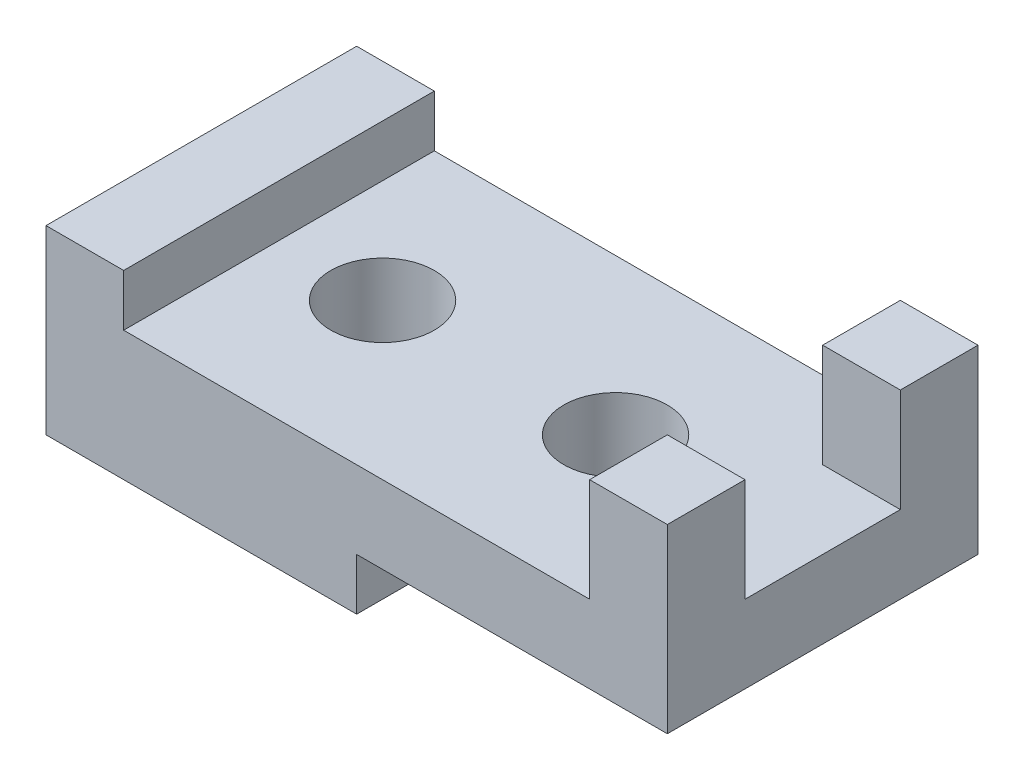
ISO-10303-21;
HEADER;
FILE_DESCRIPTION(('STEP AP214'),'2;1');
FILE_NAME('part.step','',(''),(''),'','','');
FILE_SCHEMA(('AUTOMOTIVE_DESIGN { 1 0 10303 214 1 1 1 1 }'));
ENDSEC;
DATA;
#1=APPLICATION_CONTEXT('core data for automotive mechanical design processes');
#2=APPLICATION_PROTOCOL_DEFINITION('international standard','automotive_design',2000,#1);
#3=PRODUCT_CONTEXT('',#1,'mechanical');
#4=PRODUCT('Part','Part','',(#3));
#5=PRODUCT_RELATED_PRODUCT_CATEGORY('part','',(#4));
#6=PRODUCT_DEFINITION_FORMATION('','',#4);
#7=PRODUCT_DEFINITION_CONTEXT('part definition',#1,'design');
#8=PRODUCT_DEFINITION('design','',#6,#7);
#9=PRODUCT_DEFINITION_SHAPE('','',#8);
#10=(LENGTH_UNIT() NAMED_UNIT(*) SI_UNIT(.MILLI.,.METRE.));
#11=(NAMED_UNIT(*) PLANE_ANGLE_UNIT() SI_UNIT($,.RADIAN.));
#12=(NAMED_UNIT(*) SI_UNIT($,.STERADIAN.) SOLID_ANGLE_UNIT());
#13=UNCERTAINTY_MEASURE_WITH_UNIT(LENGTH_MEASURE(1.E-05),#10,'distance_accuracy_value','');
#14=(GEOMETRIC_REPRESENTATION_CONTEXT(3) GLOBAL_UNCERTAINTY_ASSIGNED_CONTEXT((#13)) GLOBAL_UNIT_ASSIGNED_CONTEXT((#10,
#11,#12)) REPRESENTATION_CONTEXT('',''));
#15=CARTESIAN_POINT('',(0.,0.,0.));
#16=DIRECTION('',(0.,0.,1.));
#17=DIRECTION('',(1.,0.,0.));
#18=AXIS2_PLACEMENT_3D('',#15,#16,#17);
#19=CARTESIAN_POINT('',(45.,17.5,-60.));
#20=DIRECTION('',(-1.,0.,0.));
#21=DIRECTION('',(0.,0.,1.));
#22=AXIS2_PLACEMENT_3D('',#19,#20,#21);
#23=PLANE('',#22);
#24=DIRECTION('',(0.,1.,0.));
#25=VECTOR('',#24,1.);
#26=CARTESIAN_POINT('',(45.,-2.49999999999999,-45.));
#27=LINE('',#26,#25);
#28=CARTESIAN_POINT('',(45.,-2.49999999999999,-45.));
#29=VERTEX_POINT('',#28);
#30=CARTESIAN_POINT('',(45.,17.5,-45.));
#31=VERTEX_POINT('',#30);
#32=EDGE_CURVE('E320',#29,#31,#27,.T.);
#33=ORIENTED_EDGE('',*,*,#32,.T.);
#34=DIRECTION('',(0.,0.,1.));
#35=VECTOR('',#34,1.);
#36=CARTESIAN_POINT('',(45.,17.5,-60.));
#37=LINE('',#36,#35);
#38=CARTESIAN_POINT('',(45.,17.5,-60.));
#39=VERTEX_POINT('',#38);
#40=EDGE_CURVE('E162',#39,#31,#37,.T.);
#41=ORIENTED_EDGE('',*,*,#40,.F.);
#42=DIRECTION('',(0.,-1.,0.));
#43=VECTOR('',#42,1.);
#44=CARTESIAN_POINT('',(45.,17.5,-60.));
#45=LINE('',#44,#43);
#46=CARTESIAN_POINT('',(45.,-2.5,-60.));
#47=VERTEX_POINT('',#46);
#48=EDGE_CURVE('E156',#39,#47,#45,.T.);
#49=ORIENTED_EDGE('',*,*,#48,.T.);
#50=DIRECTION('',(0.,0.,1.));
#51=VECTOR('',#50,1.);
#52=CARTESIAN_POINT('',(45.,-2.5,-60.));
#53=LINE('',#52,#51);
#54=EDGE_CURVE('E135',#47,#29,#53,.T.);
#55=ORIENTED_EDGE('',*,*,#54,.T.);
#56=EDGE_LOOP('',(#33,#41,#49,#55));
#57=FACE_BOUND('',#56,.T.);
#58=ADVANCED_FACE('F38',(#57),#23,.T.);
#59=CARTESIAN_POINT('',(60.,17.5,-60.));
#60=DIRECTION('',(0.,1.,0.));
#61=DIRECTION('',(0.,0.,1.));
#62=AXIS2_PLACEMENT_3D('',#59,#60,#61);
#63=PLANE('',#62);
#64=DIRECTION('',(1.,0.,0.));
#65=VECTOR('',#64,1.);
#66=CARTESIAN_POINT('',(45.,17.5,-45.));
#67=LINE('',#66,#65);
#68=CARTESIAN_POINT('',(60.,17.5,-45.));
#69=VERTEX_POINT('',#68);
#70=EDGE_CURVE('E309',#31,#69,#67,.T.);
#71=ORIENTED_EDGE('',*,*,#70,.T.);
#72=DIRECTION('',(0.,0.,1.));
#73=VECTOR('',#72,1.);
#74=CARTESIAN_POINT('',(60.,17.5,-60.));
#75=LINE('',#74,#73);
#76=CARTESIAN_POINT('',(60.,17.5,-60.));
#77=VERTEX_POINT('',#76);
#78=EDGE_CURVE('E220',#77,#69,#75,.T.);
#79=ORIENTED_EDGE('',*,*,#78,.F.);
#80=DIRECTION('',(-1.,0.,0.));
#81=VECTOR('',#80,1.);
#82=CARTESIAN_POINT('',(60.,17.5,-60.));
#83=LINE('',#82,#81);
#84=EDGE_CURVE('E164',#77,#39,#83,.T.);
#85=ORIENTED_EDGE('',*,*,#84,.T.);
#86=ORIENTED_EDGE('',*,*,#40,.T.);
#87=EDGE_LOOP('',(#71,#79,#85,#86));
#88=FACE_BOUND('',#87,.T.);
#89=ADVANCED_FACE('F387',(#88),#63,.T.);
#90=CARTESIAN_POINT('',(-45.,7.5,-60.));
#91=DIRECTION('',(0.,1.,0.));
#92=DIRECTION('',(-1.,0.,0.));
#93=AXIS2_PLACEMENT_3D('',#90,#91,#92);
#94=PLANE('',#93);
#95=DIRECTION('',(-1.,0.,0.));
#96=VECTOR('',#95,1.);
#97=CARTESIAN_POINT('',(-45.,7.5,0.));
#98=LINE('',#97,#96);
#99=CARTESIAN_POINT('',(-45.,7.5,0.));
#100=VERTEX_POINT('',#99);
#101=CARTESIAN_POINT('',(-60.,7.49999999999999,0.));
#102=VERTEX_POINT('',#101);
#103=EDGE_CURVE('E174',#100,#102,#98,.T.);
#104=ORIENTED_EDGE('',*,*,#103,.F.);
#105=DIRECTION('',(0.,0.,1.));
#106=VECTOR('',#105,1.);
#107=CARTESIAN_POINT('',(-45.,7.5,-60.));
#108=LINE('',#107,#106);
#109=CARTESIAN_POINT('',(-45.,7.5,-60.));
#110=VERTEX_POINT('',#109);
#111=EDGE_CURVE('E11',#110,#100,#108,.T.);
#112=ORIENTED_EDGE('',*,*,#111,.F.);
#113=DIRECTION('',(-1.,0.,0.));
#114=VECTOR('',#113,1.);
#115=CARTESIAN_POINT('',(-45.,7.5,-60.));
#116=LINE('',#115,#114);
#117=CARTESIAN_POINT('',(-60.,7.49999999999999,-60.));
#118=VERTEX_POINT('',#117);
#119=EDGE_CURVE('E213',#110,#118,#116,.T.);
#120=ORIENTED_EDGE('',*,*,#119,.T.);
#121=DIRECTION('',(0.,0.,1.));
#122=VECTOR('',#121,1.);
#123=CARTESIAN_POINT('',(-60.,7.49999999999999,-60.));
#124=LINE('',#123,#122);
#125=EDGE_CURVE('E108',#118,#102,#124,.T.);
#126=ORIENTED_EDGE('',*,*,#125,.T.);
#127=EDGE_LOOP('',(#104,#112,#120,#126));
#128=FACE_BOUND('',#127,.T.);
#129=ADVANCED_FACE('F40',(#128),#94,.T.);
#130=CARTESIAN_POINT('',(-45.,-2.50000000000001,-60.));
#131=DIRECTION('',(1.,0.,0.));
#132=DIRECTION('',(0.,0.,-1.));
#133=AXIS2_PLACEMENT_3D('',#130,#131,#132);
#134=PLANE('',#133);
#135=DIRECTION('',(0.,1.,0.));
#136=VECTOR('',#135,1.);
#137=CARTESIAN_POINT('',(-45.,-2.50000000000001,0.));
#138=LINE('',#137,#136);
#139=CARTESIAN_POINT('',(-45.,-2.50000000000001,0.));
#140=VERTEX_POINT('',#139);
#141=EDGE_CURVE('E210',#140,#100,#138,.T.);
#142=ORIENTED_EDGE('',*,*,#141,.F.);
#143=DIRECTION('',(0.,0.,1.));
#144=VECTOR('',#143,1.);
#145=CARTESIAN_POINT('',(-45.,-2.50000000000001,-60.));
#146=LINE('',#145,#144);
#147=CARTESIAN_POINT('',(-45.,-2.50000000000001,-60.));
#148=VERTEX_POINT('',#147);
#149=EDGE_CURVE('E48',#148,#140,#146,.T.);
#150=ORIENTED_EDGE('',*,*,#149,.F.);
#151=DIRECTION('',(0.,1.,0.));
#152=VECTOR('',#151,1.);
#153=CARTESIAN_POINT('',(-45.,-2.50000000000001,-60.));
#154=LINE('',#153,#152);
#155=EDGE_CURVE('E158',#148,#110,#154,.T.);
#156=ORIENTED_EDGE('',*,*,#155,.T.);
#157=ORIENTED_EDGE('',*,*,#111,.T.);
#158=EDGE_LOOP('',(#142,#150,#156,#157));
#159=FACE_BOUND('',#158,.T.);
#160=ADVANCED_FACE('F242',(#159),#134,.T.);
#161=CARTESIAN_POINT('',(45.,-2.5,-60.));
#162=DIRECTION('',(0.,1.,0.));
#163=DIRECTION('',(-1.,0.,0.));
#164=AXIS2_PLACEMENT_3D('',#161,#162,#163);
#165=PLANE('',#164);
#166=CARTESIAN_POINT('',(-25.,-2.5,-30.));
#167=DIRECTION('',(0.,1.,0.));
#168=DIRECTION('',(-1.,0.,0.));
#169=AXIS2_PLACEMENT_3D('',#166,#167,#168);
#170=CIRCLE('',#169,10.);
#171=CARTESIAN_POINT('',(-35.,-2.5,-30.));
#172=VERTEX_POINT('',#171);
#173=EDGE_CURVE('E308',#172,#172,#170,.T.);
#174=ORIENTED_EDGE('',*,*,#173,.F.);
#175=EDGE_LOOP('',(#174));
#176=FACE_BOUND('',#175,.T.);
#177=CARTESIAN_POINT('',(20.,-2.5,-30.));
#178=DIRECTION('',(0.,1.,0.));
#179=DIRECTION('',(-1.,0.,0.));
#180=AXIS2_PLACEMENT_3D('',#177,#178,#179);
#181=CIRCLE('',#180,10.);
#182=CARTESIAN_POINT('',(9.99999999999999,-2.5,-30.));
#183=VERTEX_POINT('',#182);
#184=EDGE_CURVE('E304',#183,#183,#181,.T.);
#185=ORIENTED_EDGE('',*,*,#184,.F.);
#186=EDGE_LOOP('',(#185));
#187=FACE_BOUND('',#186,.T.);
#188=DIRECTION('',(-1.,0.,0.));
#189=VECTOR('',#188,1.);
#190=CARTESIAN_POINT('',(45.,-2.5,0.));
#191=LINE('',#190,#189);
#192=CARTESIAN_POINT('',(45.,-2.5,0.));
#193=VERTEX_POINT('',#192);
#194=EDGE_CURVE('E206',#193,#140,#191,.T.);
#195=ORIENTED_EDGE('',*,*,#194,.F.);
#196=CARTESIAN_POINT('',(45.,-2.49999999999999,-15.));
#197=VERTEX_POINT('',#196);
#198=EDGE_CURVE('E150',#197,#193,#53,.T.);
#199=ORIENTED_EDGE('',*,*,#198,.F.);
#200=DIRECTION('',(1.,0.,0.));
#201=VECTOR('',#200,1.);
#202=CARTESIAN_POINT('',(45.,-2.49999999999999,-15.));
#203=LINE('',#202,#201);
#204=CARTESIAN_POINT('',(60.,-2.49999999999999,-15.));
#205=VERTEX_POINT('',#204);
#206=EDGE_CURVE('E319',#197,#205,#203,.T.);
#207=ORIENTED_EDGE('',*,*,#206,.T.);
#208=DIRECTION('',(0.,0.,-1.));
#209=VECTOR('',#208,1.);
#210=CARTESIAN_POINT('',(60.,-2.49999999999999,-15.));
#211=LINE('',#210,#209);
#212=CARTESIAN_POINT('',(60.,-2.49999999999999,-45.));
#213=VERTEX_POINT('',#212);
#214=EDGE_CURVE('E332',#205,#213,#211,.T.);
#215=ORIENTED_EDGE('',*,*,#214,.T.);
#216=DIRECTION('',(1.,0.,0.));
#217=VECTOR('',#216,1.);
#218=CARTESIAN_POINT('',(45.,-2.49999999999999,-45.));
#219=LINE('',#218,#217);
#220=EDGE_CURVE('E144',#29,#213,#219,.T.);
#221=ORIENTED_EDGE('',*,*,#220,.F.);
#222=ORIENTED_EDGE('',*,*,#54,.F.);
#223=DIRECTION('',(-1.,0.,0.));
#224=VECTOR('',#223,1.);
#225=CARTESIAN_POINT('',(45.,-2.5,-60.));
#226=LINE('',#225,#224);
#227=EDGE_CURVE('E139',#47,#148,#226,.T.);
#228=ORIENTED_EDGE('',*,*,#227,.T.);
#229=ORIENTED_EDGE('',*,*,#149,.T.);
#230=EDGE_LOOP('',(#195,#199,#207,#215,#221,#222,#228,#229));
#231=FACE_BOUND('',#230,.T.);
#232=ADVANCED_FACE('F138',(#176,#187,#231),#165,.T.);
#233=DIRECTION('',(0.,-1.,0.));
#234=VECTOR('',#233,1.);
#235=CARTESIAN_POINT('',(45.,17.5,-15.));
#236=LINE('',#235,#234);
#237=CARTESIAN_POINT('',(45.,17.5,-15.));
#238=VERTEX_POINT('',#237);
#239=EDGE_CURVE('E253',#238,#197,#236,.T.);
#240=ORIENTED_EDGE('',*,*,#239,.T.);
#241=ORIENTED_EDGE('',*,*,#198,.T.);
#242=DIRECTION('',(0.,-1.,0.));
#243=VECTOR('',#242,1.);
#244=CARTESIAN_POINT('',(45.,17.5,0.));
#245=LINE('',#244,#243);
#246=CARTESIAN_POINT('',(45.,17.5,0.));
#247=VERTEX_POINT('',#246);
#248=EDGE_CURVE('E202',#247,#193,#245,.T.);
#249=ORIENTED_EDGE('',*,*,#248,.F.);
#250=EDGE_CURVE('E219',#238,#247,#37,.T.);
#251=ORIENTED_EDGE('',*,*,#250,.F.);
#252=EDGE_LOOP('',(#240,#241,#249,#251));
#253=FACE_BOUND('',#252,.T.);
#254=ADVANCED_FACE('F251',(#253),#23,.T.);
#255=DIRECTION('',(1.,0.,0.));
#256=VECTOR('',#255,1.);
#257=CARTESIAN_POINT('',(45.,17.5,-15.));
#258=LINE('',#257,#256);
#259=CARTESIAN_POINT('',(60.,17.5,-15.));
#260=VERTEX_POINT('',#259);
#261=EDGE_CURVE('E56',#238,#260,#258,.T.);
#262=ORIENTED_EDGE('',*,*,#261,.F.);
#263=ORIENTED_EDGE('',*,*,#250,.T.);
#264=DIRECTION('',(-1.,0.,0.));
#265=VECTOR('',#264,1.);
#266=CARTESIAN_POINT('',(60.,17.5,0.));
#267=LINE('',#266,#265);
#268=CARTESIAN_POINT('',(60.,17.5,0.));
#269=VERTEX_POINT('',#268);
#270=EDGE_CURVE('E198',#269,#247,#267,.T.);
#271=ORIENTED_EDGE('',*,*,#270,.F.);
#272=EDGE_CURVE('E224',#260,#269,#75,.T.);
#273=ORIENTED_EDGE('',*,*,#272,.F.);
#274=EDGE_LOOP('',(#262,#263,#271,#273));
#275=FACE_BOUND('',#274,.T.);
#276=ADVANCED_FACE('F275',(#275),#63,.T.);
#277=CARTESIAN_POINT('',(60.,-17.5,-60.));
#278=DIRECTION('',(1.,0.,0.));
#279=DIRECTION('',(0.,0.,-1.));
#280=AXIS2_PLACEMENT_3D('',#277,#278,#279);
#281=PLANE('',#280);
#282=DIRECTION('',(0.,1.,0.));
#283=VECTOR('',#282,1.);
#284=CARTESIAN_POINT('',(60.,-2.49999999999999,-45.));
#285=LINE('',#284,#283);
#286=EDGE_CURVE('E328',#213,#69,#285,.T.);
#287=ORIENTED_EDGE('',*,*,#286,.F.);
#288=ORIENTED_EDGE('',*,*,#214,.F.);
#289=DIRECTION('',(0.,-1.,0.));
#290=VECTOR('',#289,1.);
#291=CARTESIAN_POINT('',(60.,17.5,-15.));
#292=LINE('',#291,#290);
#293=EDGE_CURVE('E273',#260,#205,#292,.T.);
#294=ORIENTED_EDGE('',*,*,#293,.F.);
#295=ORIENTED_EDGE('',*,*,#272,.T.);
#296=DIRECTION('',(0.,1.,0.));
#297=VECTOR('',#296,1.);
#298=CARTESIAN_POINT('',(60.,-17.5,0.));
#299=LINE('',#298,#297);
#300=CARTESIAN_POINT('',(60.,-17.5,0.));
#301=VERTEX_POINT('',#300);
#302=EDGE_CURVE('E194',#301,#269,#299,.T.);
#303=ORIENTED_EDGE('',*,*,#302,.F.);
#304=DIRECTION('',(0.,0.,1.));
#305=VECTOR('',#304,1.);
#306=CARTESIAN_POINT('',(60.,-17.5,-60.));
#307=LINE('',#306,#305);
#308=CARTESIAN_POINT('',(60.,-17.5,-60.));
#309=VERTEX_POINT('',#308);
#310=EDGE_CURVE('E225',#309,#301,#307,.T.);
#311=ORIENTED_EDGE('',*,*,#310,.F.);
#312=DIRECTION('',(0.,1.,0.));
#313=VECTOR('',#312,1.);
#314=CARTESIAN_POINT('',(60.,-17.5,-60.));
#315=LINE('',#314,#313);
#316=EDGE_CURVE('E168',#309,#77,#315,.T.);
#317=ORIENTED_EDGE('',*,*,#316,.T.);
#318=ORIENTED_EDGE('',*,*,#78,.T.);
#319=EDGE_LOOP('',(#287,#288,#294,#295,#303,#311,#317,#318));
#320=FACE_BOUND('',#319,.T.);
#321=ADVANCED_FACE('F271',(#320),#281,.T.);
#322=CARTESIAN_POINT('',(0.,-17.5,-60.));
#323=DIRECTION('',(0.,-1.,0.));
#324=DIRECTION('',(1.,0.,0.));
#325=AXIS2_PLACEMENT_3D('',#322,#323,#324);
#326=PLANE('',#325);
#327=CARTESIAN_POINT('',(20.,-17.5,-30.));
#328=DIRECTION('',(0.,-1.,0.));
#329=DIRECTION('',(1.,0.,0.));
#330=AXIS2_PLACEMENT_3D('',#327,#328,#329);
#331=CIRCLE('',#330,10.);
#332=CARTESIAN_POINT('',(30.,-17.5,-30.));
#333=VERTEX_POINT('',#332);
#334=EDGE_CURVE('E42',#333,#333,#331,.T.);
#335=ORIENTED_EDGE('',*,*,#334,.F.);
#336=EDGE_LOOP('',(#335));
#337=FACE_BOUND('',#336,.T.);
#338=DIRECTION('',(1.,0.,0.));
#339=VECTOR('',#338,1.);
#340=CARTESIAN_POINT('',(0.,-17.5,0.));
#341=LINE('',#340,#339);
#342=CARTESIAN_POINT('',(0.,-17.5,0.));
#343=VERTEX_POINT('',#342);
#344=EDGE_CURVE('E190',#343,#301,#341,.T.);
#345=ORIENTED_EDGE('',*,*,#344,.F.);
#346=DIRECTION('',(0.,0.,1.));
#347=VECTOR('',#346,1.);
#348=CARTESIAN_POINT('',(0.,-17.5,-60.));
#349=LINE('',#348,#347);
#350=CARTESIAN_POINT('',(0.,-17.5,-60.));
#351=VERTEX_POINT('',#350);
#352=EDGE_CURVE('E228',#351,#343,#349,.T.);
#353=ORIENTED_EDGE('',*,*,#352,.F.);
#354=DIRECTION('',(1.,0.,0.));
#355=VECTOR('',#354,1.);
#356=CARTESIAN_POINT('',(0.,-17.5,-60.));
#357=LINE('',#356,#355);
#358=EDGE_CURVE('E282',#351,#309,#357,.T.);
#359=ORIENTED_EDGE('',*,*,#358,.T.);
#360=ORIENTED_EDGE('',*,*,#310,.T.);
#361=EDGE_LOOP('',(#345,#353,#359,#360));
#362=FACE_BOUND('',#361,.T.);
#363=ADVANCED_FACE('F279',(#337,#362),#326,.T.);
#364=CARTESIAN_POINT('',(0.,-27.5,-60.));
#365=DIRECTION('',(1.,0.,0.));
#366=DIRECTION('',(0.,1.,0.));
#367=AXIS2_PLACEMENT_3D('',#364,#365,#366);
#368=PLANE('',#367);
#369=DIRECTION('',(0.,1.,0.));
#370=VECTOR('',#369,1.);
#371=CARTESIAN_POINT('',(0.,-27.5,0.));
#372=LINE('',#371,#370);
#373=CARTESIAN_POINT('',(0.,-27.5,0.));
#374=VERTEX_POINT('',#373);
#375=EDGE_CURVE('E186',#374,#343,#372,.T.);
#376=ORIENTED_EDGE('',*,*,#375,.F.);
#377=DIRECTION('',(0.,0.,1.));
#378=VECTOR('',#377,1.);
#379=CARTESIAN_POINT('',(0.,-27.5,-60.));
#380=LINE('',#379,#378);
#381=CARTESIAN_POINT('',(0.,-27.5,-60.));
#382=VERTEX_POINT('',#381);
#383=EDGE_CURVE('E231',#382,#374,#380,.T.);
#384=ORIENTED_EDGE('',*,*,#383,.F.);
#385=DIRECTION('',(0.,1.,0.));
#386=VECTOR('',#385,1.);
#387=CARTESIAN_POINT('',(0.,-27.5,-60.));
#388=LINE('',#387,#386);
#389=EDGE_CURVE('E290',#382,#351,#388,.T.);
#390=ORIENTED_EDGE('',*,*,#389,.T.);
#391=ORIENTED_EDGE('',*,*,#352,.T.);
#392=EDGE_LOOP('',(#376,#384,#390,#391));
#393=FACE_BOUND('',#392,.T.);
#394=ADVANCED_FACE('F376',(#393),#368,.T.);
#395=CARTESIAN_POINT('',(-60.,-27.5,-60.));
#396=DIRECTION('',(0.,-1.,0.));
#397=DIRECTION('',(0.,0.,-1.));
#398=AXIS2_PLACEMENT_3D('',#395,#396,#397);
#399=PLANE('',#398);
#400=CARTESIAN_POINT('',(-25.,-27.5,-30.));
#401=DIRECTION('',(0.,1.,0.));
#402=DIRECTION('',(-1.,0.,0.));
#403=AXIS2_PLACEMENT_3D('',#400,#401,#402);
#404=CIRCLE('',#403,10.);
#405=CARTESIAN_POINT('',(-35.,-27.5,-30.));
#406=VERTEX_POINT('',#405);
#407=EDGE_CURVE('E313',#406,#406,#404,.T.);
#408=ORIENTED_EDGE('',*,*,#407,.T.);
#409=EDGE_LOOP('',(#408));
#410=FACE_BOUND('',#409,.T.);
#411=DIRECTION('',(1.,0.,0.));
#412=VECTOR('',#411,1.);
#413=CARTESIAN_POINT('',(-60.,-27.5,0.));
#414=LINE('',#413,#412);
#415=CARTESIAN_POINT('',(-60.,-27.5,0.));
#416=VERTEX_POINT('',#415);
#417=EDGE_CURVE('E182',#416,#374,#414,.T.);
#418=ORIENTED_EDGE('',*,*,#417,.F.);
#419=DIRECTION('',(0.,0.,1.));
#420=VECTOR('',#419,1.);
#421=CARTESIAN_POINT('',(-60.,-27.5,-60.));
#422=LINE('',#421,#420);
#423=CARTESIAN_POINT('',(-60.,-27.5,-60.));
#424=VERTEX_POINT('',#423);
#425=EDGE_CURVE('E234',#424,#416,#422,.T.);
#426=ORIENTED_EDGE('',*,*,#425,.F.);
#427=DIRECTION('',(1.,0.,0.));
#428=VECTOR('',#427,1.);
#429=CARTESIAN_POINT('',(-60.,-27.5,-60.));
#430=LINE('',#429,#428);
#431=EDGE_CURVE('E295',#424,#382,#430,.T.);
#432=ORIENTED_EDGE('',*,*,#431,.T.);
#433=ORIENTED_EDGE('',*,*,#383,.T.);
#434=EDGE_LOOP('',(#418,#426,#432,#433));
#435=FACE_BOUND('',#434,.T.);
#436=ADVANCED_FACE('F382',(#410,#435),#399,.T.);
#437=CARTESIAN_POINT('',(-60.,7.49999999999999,-60.));
#438=DIRECTION('',(-1.,0.,0.));
#439=DIRECTION('',(0.,-1.,0.));
#440=AXIS2_PLACEMENT_3D('',#437,#438,#439);
#441=PLANE('',#440);
#442=DIRECTION('',(0.,-1.,0.));
#443=VECTOR('',#442,1.);
#444=CARTESIAN_POINT('',(-60.,7.49999999999999,0.));
#445=LINE('',#444,#443);
#446=EDGE_CURVE('E178',#102,#416,#445,.T.);
#447=ORIENTED_EDGE('',*,*,#446,.F.);
#448=ORIENTED_EDGE('',*,*,#125,.F.);
#449=DIRECTION('',(0.,-1.,0.));
#450=VECTOR('',#449,1.);
#451=CARTESIAN_POINT('',(-60.,7.49999999999999,-60.));
#452=LINE('',#451,#450);
#453=EDGE_CURVE('E299',#118,#424,#452,.T.);
#454=ORIENTED_EDGE('',*,*,#453,.T.);
#455=ORIENTED_EDGE('',*,*,#425,.T.);
#456=EDGE_LOOP('',(#447,#448,#454,#455));
#457=FACE_BOUND('',#456,.T.);
#458=ADVANCED_FACE('F238',(#457),#441,.T.);
#459=CARTESIAN_POINT('',(0.,0.,-60.));
#460=DIRECTION('',(0.,0.,1.));
#461=DIRECTION('',(1.,0.,0.));
#462=AXIS2_PLACEMENT_3D('',#459,#460,#461);
#463=PLANE('',#462);
#464=ORIENTED_EDGE('',*,*,#119,.F.);
#465=ORIENTED_EDGE('',*,*,#155,.F.);
#466=ORIENTED_EDGE('',*,*,#227,.F.);
#467=ORIENTED_EDGE('',*,*,#48,.F.);
#468=ORIENTED_EDGE('',*,*,#84,.F.);
#469=ORIENTED_EDGE('',*,*,#316,.F.);
#470=ORIENTED_EDGE('',*,*,#358,.F.);
#471=ORIENTED_EDGE('',*,*,#389,.F.);
#472=ORIENTED_EDGE('',*,*,#431,.F.);
#473=ORIENTED_EDGE('',*,*,#453,.F.);
#474=EDGE_LOOP('',(#464,#465,#466,#467,#468,#469,#470,#471,#472,#473));
#475=FACE_BOUND('',#474,.T.);
#476=ADVANCED_FACE('F154',(#475),#463,.F.);
#477=CARTESIAN_POINT('',(0.,0.,0.));
#478=DIRECTION('',(0.,0.,1.));
#479=DIRECTION('',(1.,0.,0.));
#480=AXIS2_PLACEMENT_3D('',#477,#478,#479);
#481=PLANE('',#480);
#482=ORIENTED_EDGE('',*,*,#103,.T.);
#483=ORIENTED_EDGE('',*,*,#446,.T.);
#484=ORIENTED_EDGE('',*,*,#417,.T.);
#485=ORIENTED_EDGE('',*,*,#375,.T.);
#486=ORIENTED_EDGE('',*,*,#344,.T.);
#487=ORIENTED_EDGE('',*,*,#302,.T.);
#488=ORIENTED_EDGE('',*,*,#270,.T.);
#489=ORIENTED_EDGE('',*,*,#248,.T.);
#490=ORIENTED_EDGE('',*,*,#194,.T.);
#491=ORIENTED_EDGE('',*,*,#141,.T.);
#492=EDGE_LOOP('',(#482,#483,#484,#485,#486,#487,#488,#489,#490,#491));
#493=FACE_BOUND('',#492,.T.);
#494=ADVANCED_FACE('F241',(#493),#481,.T.);
#495=CARTESIAN_POINT('',(-25.,-27.5,-30.));
#496=DIRECTION('',(0.,1.,0.));
#497=DIRECTION('',(-1.,0.,0.));
#498=AXIS2_PLACEMENT_3D('',#495,#496,#497);
#499=CYLINDRICAL_SURFACE('',#498,10.);
#500=ORIENTED_EDGE('',*,*,#407,.F.);
#501=EDGE_LOOP('',(#500));
#502=FACE_BOUND('',#501,.T.);
#503=ORIENTED_EDGE('',*,*,#173,.T.);
#504=EDGE_LOOP('',(#503));
#505=FACE_BOUND('',#504,.T.);
#506=ADVANCED_FACE('F410',(#502,#505),#499,.F.);
#507=CARTESIAN_POINT('',(20.,-27.5,-30.));
#508=DIRECTION('',(0.,1.,0.));
#509=DIRECTION('',(-1.,0.,0.));
#510=AXIS2_PLACEMENT_3D('',#507,#508,#509);
#511=CYLINDRICAL_SURFACE('',#510,10.);
#512=ORIENTED_EDGE('',*,*,#334,.T.);
#513=EDGE_LOOP('',(#512));
#514=FACE_BOUND('',#513,.T.);
#515=ORIENTED_EDGE('',*,*,#184,.T.);
#516=EDGE_LOOP('',(#515));
#517=FACE_BOUND('',#516,.T.);
#518=ADVANCED_FACE('F372',(#514,#517),#511,.F.);
#519=CARTESIAN_POINT('',(45.,-2.49999999999999,-45.));
#520=DIRECTION('',(0.,0.,-1.));
#521=DIRECTION('',(-1.,0.,0.));
#522=AXIS2_PLACEMENT_3D('',#519,#520,#521);
#523=PLANE('',#522);
#524=ORIENTED_EDGE('',*,*,#286,.T.);
#525=ORIENTED_EDGE('',*,*,#70,.F.);
#526=ORIENTED_EDGE('',*,*,#32,.F.);
#527=ORIENTED_EDGE('',*,*,#220,.T.);
#528=EDGE_LOOP('',(#524,#525,#526,#527));
#529=FACE_BOUND('',#528,.T.);
#530=ADVANCED_FACE('F415',(#529),#523,.F.);
#531=CARTESIAN_POINT('',(45.,17.5,-15.));
#532=DIRECTION('',(0.,0.,1.));
#533=DIRECTION('',(0.,-1.,0.));
#534=AXIS2_PLACEMENT_3D('',#531,#532,#533);
#535=PLANE('',#534);
#536=ORIENTED_EDGE('',*,*,#293,.T.);
#537=ORIENTED_EDGE('',*,*,#206,.F.);
#538=ORIENTED_EDGE('',*,*,#239,.F.);
#539=ORIENTED_EDGE('',*,*,#261,.T.);
#540=EDGE_LOOP('',(#536,#537,#538,#539));
#541=FACE_BOUND('',#540,.T.);
#542=ADVANCED_FACE('F419',(#541),#535,.F.);
#543=CLOSED_SHELL('',(#58,#89,#129,#160,#232,#254,#276,#321,#363,#394,#436,#458,#476,#494,#506,
#518,#530,#542));
#544=MANIFOLD_SOLID_BREP('B2',#543);
#545=ADVANCED_BREP_SHAPE_REPRESENTATION('',(#18,#544),#14);
#546=SHAPE_DEFINITION_REPRESENTATION(#9,#545);
ENDSEC;
END-ISO-10303-21;
